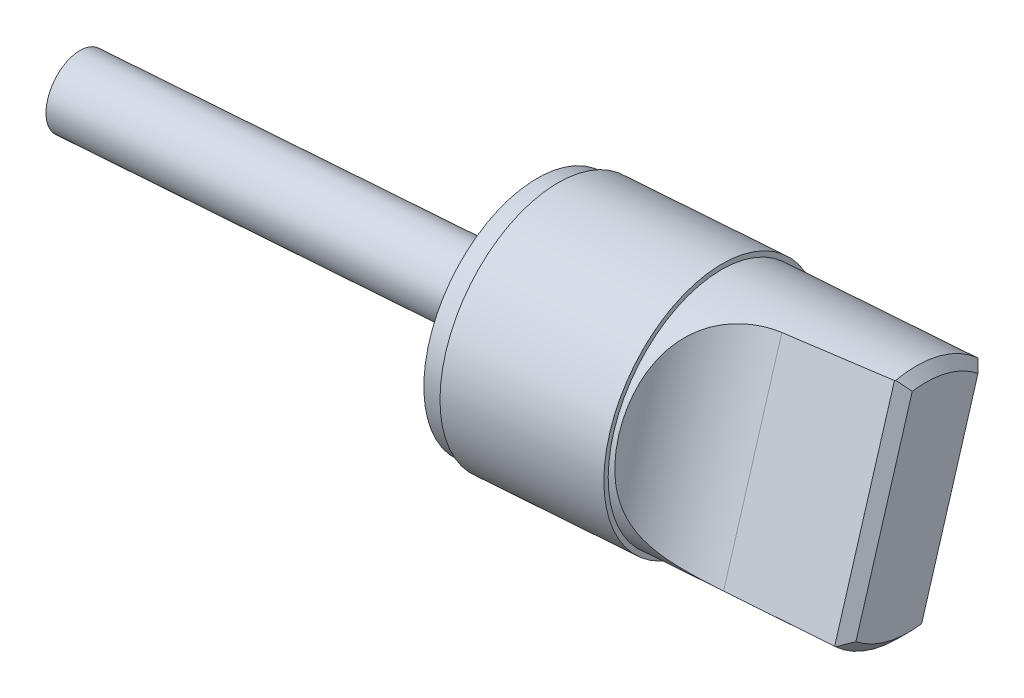
ISO-10303-21;
HEADER;
FILE_DESCRIPTION(('STEP AP214'),'2;1');
FILE_NAME('part.step','',(''),(''),'','','');
FILE_SCHEMA(('AUTOMOTIVE_DESIGN { 1 0 10303 214 1 1 1 1 }'));
ENDSEC;
DATA;
#1=APPLICATION_CONTEXT('core data for automotive mechanical design processes');
#2=APPLICATION_PROTOCOL_DEFINITION('international standard','automotive_design',2000,#1);
#3=PRODUCT_CONTEXT('',#1,'mechanical');
#4=PRODUCT('Part','Part','',(#3));
#5=PRODUCT_RELATED_PRODUCT_CATEGORY('part','',(#4));
#6=PRODUCT_DEFINITION_FORMATION('','',#4);
#7=PRODUCT_DEFINITION_CONTEXT('part definition',#1,'design');
#8=PRODUCT_DEFINITION('design','',#6,#7);
#9=PRODUCT_DEFINITION_SHAPE('','',#8);
#10=(LENGTH_UNIT() NAMED_UNIT(*) SI_UNIT(.MILLI.,.METRE.));
#11=(NAMED_UNIT(*) PLANE_ANGLE_UNIT() SI_UNIT($,.RADIAN.));
#12=(NAMED_UNIT(*) SI_UNIT($,.STERADIAN.) SOLID_ANGLE_UNIT());
#13=UNCERTAINTY_MEASURE_WITH_UNIT(LENGTH_MEASURE(1.E-05),#10,'distance_accuracy_value','');
#14=(GEOMETRIC_REPRESENTATION_CONTEXT(3) GLOBAL_UNCERTAINTY_ASSIGNED_CONTEXT((#13)) GLOBAL_UNIT_ASSIGNED_CONTEXT((#10,
#11,#12)) REPRESENTATION_CONTEXT('',''));
#15=CARTESIAN_POINT('',(0.,0.,0.));
#16=DIRECTION('',(0.,0.,1.));
#17=DIRECTION('',(1.,0.,0.));
#18=AXIS2_PLACEMENT_3D('',#15,#16,#17);
#19=CARTESIAN_POINT('',(3.76879724117186,23.5167781761015,111.248924543488));
#20=DIRECTION('',(-0.996509233346203,0.00668462435295313,0.0832145639478056));
#21=DIRECTION('',(0.0832164231983383,0.,0.996531498202679));
#22=AXIS2_PLACEMENT_3D('',#19,#20,#21);
#23=PLANE('',#22);
#24=CARTESIAN_POINT('',(3.76879724117186,23.5167781761015,111.248924543488));
#25=DIRECTION('',(-0.996509233346203,0.00668462435295313,0.0832145639478056));
#26=DIRECTION('',(0.0832164231983383,0.,0.996531498202679));
#27=AXIS2_PLACEMENT_3D('',#24,#25,#26);
#28=CIRCLE('',#27,5.99999999999998);
#29=CARTESIAN_POINT('',(3.26949870198183,23.5167781761015,105.269735554272));
#30=VERTEX_POINT('',#29);
#31=EDGE_CURVE('E279',#30,#30,#28,.T.);
#32=ORIENTED_EDGE('',*,*,#31,.T.);
#33=EDGE_LOOP('',(#32));
#34=FACE_BOUND('',#33,.T.);
#35=CARTESIAN_POINT('',(3.76879724117186,23.5167781761015,111.248924543488));
#36=DIRECTION('',(-0.996509233346203,0.00668462435295313,0.0832145639478056));
#37=DIRECTION('',(0.0832164231983383,0.,0.996531498202679));
#38=AXIS2_PLACEMENT_3D('',#35,#36,#37);
#39=CIRCLE('',#38,1.79999999999998);
#40=CARTESIAN_POINT('',(3.91858680292887,23.5167781761015,113.042681240252));
#41=VERTEX_POINT('',#40);
#42=EDGE_CURVE('E285',#41,#41,#39,.F.);
#43=ORIENTED_EDGE('',*,*,#42,.T.);
#44=EDGE_LOOP('',(#43));
#45=FACE_BOUND('',#44,.T.);
#46=ADVANCED_FACE('F40',(#34,#45),#23,.T.);
#47=CARTESIAN_POINT('',(4.76530647451807,23.5100935517485,111.16570997954));
#48=DIRECTION('',(-0.996509233346203,0.00668462435295313,0.0832145639478056));
#49=DIRECTION('',(0.0832164231983383,0.,0.996531498202679));
#50=AXIS2_PLACEMENT_3D('',#47,#48,#49);
#51=PLANE('',#50);
#52=CARTESIAN_POINT('',(4.76530647451807,23.5100935517485,111.16570997954));
#53=DIRECTION('',(0.996509233346203,-0.00668462435295313,-0.0832145639478056));
#54=DIRECTION('',(0.0832164231983383,0.,0.996531498202679));
#55=AXIS2_PLACEMENT_3D('',#52,#53,#54);
#56=CIRCLE('',#55,6.24999999999999);
#57=CARTESIAN_POINT('',(5.28540911950768,23.5100935517485,117.394031843307));
#58=VERTEX_POINT('',#57);
#59=EDGE_CURVE('E275',#58,#58,#56,.T.);
#60=ORIENTED_EDGE('',*,*,#59,.F.);
#61=EDGE_LOOP('',(#60));
#62=FACE_BOUND('',#61,.T.);
#63=CARTESIAN_POINT('',(4.76530647451806,23.5100935517485,111.16570997954));
#64=DIRECTION('',(-0.996509233346203,0.00668462435295313,0.0832145639478056));
#65=DIRECTION('',(0.0832164231983383,0.,0.996531498202679));
#66=AXIS2_PLACEMENT_3D('',#63,#64,#65);
#67=CIRCLE('',#66,5.99999999999998);
#68=CARTESIAN_POINT('',(4.26600793532803,23.5100935517485,105.186520990324));
#69=VERTEX_POINT('',#68);
#70=EDGE_CURVE('E282',#69,#69,#67,.T.);
#71=ORIENTED_EDGE('',*,*,#70,.F.);
#72=EDGE_LOOP('',(#71));
#73=FACE_BOUND('',#72,.T.);
#74=ADVANCED_FACE('F158',(#62,#73),#51,.T.);
#75=CARTESIAN_POINT('',(-40.0776090260611,23.8109016476314,114.910365357191));
#76=DIRECTION('',(-0.996509233346203,0.00668462435295313,0.0832145639478055));
#77=DIRECTION('',(0.0832164231983383,0.,0.996531498202679));
#78=AXIS2_PLACEMENT_3D('',#75,#76,#77);
#79=CYLINDRICAL_SURFACE('',#78,6.);
#80=CARTESIAN_POINT('',(17.0975541159979,29.335845858678,111.187569793292));
#81=CARTESIAN_POINT('',(17.307128040966,29.3368138773272,111.156598978778));
#82=CARTESIAN_POINT('',(17.516704575209,29.3377318237993,111.12564425978));
#83=CARTESIAN_POINT('',(17.9375998330878,29.3394758251393,111.063510204415));
#84=CARTESIAN_POINT('',(18.1489185992333,29.3403010553089,111.032331132851));
#85=CARTESIAN_POINT('',(18.5732983453913,29.3418582325442,110.969748781073));
#86=CARTESIAN_POINT('',(18.786359367326,29.3425893570261,110.938345764685));
#87=CARTESIAN_POINT('',(19.2142236526041,29.343956916831,110.875315957174));
#88=CARTESIAN_POINT('',(19.4290269573239,29.3445925315143,110.843689429126));
#89=CARTESIAN_POINT('',(19.8603758366521,29.3457676642143,110.780213047417));
#90=CARTESIAN_POINT('',(20.0769214521137,29.3463063634768,110.748363456222));
#91=CARTESIAN_POINT('',(20.5117549830615,29.3472862523289,110.684441416073));
#92=CARTESIAN_POINT('',(20.7300429389059,29.3477266249604,110.652369229141));
#93=CARTESIAN_POINT('',(21.168361181804,29.3485084460693,110.588002481347));
#94=CARTESIAN_POINT('',(21.388391508743,29.3488490793302,110.555708182201));
#95=CARTESIAN_POINT('',(21.8301945279037,29.3494299946947,110.490897718623));
#96=CARTESIAN_POINT('',(22.0519672595734,29.3496694631833,110.458381815802));
#97=CARTESIAN_POINT('',(22.2737424701569,29.3498573213283,110.425882534628));
#98=B_SPLINE_CURVE_WITH_KNOTS('',3,(#80,#81,#82,#83,#84,#85,#86,#87,#88,#89,#90,#91,#92,#93,#94,
#95,#96,#97),.UNSPECIFIED.,.F.,.F.,(4,2,2,2,2,2,2,2,4),(0.,0.635556619465426,1.27638100599797,
1.92247319279063,2.57383321223107,3.23046109592741,3.89235687473314,4.55952057877082,
5.23195223745506),.UNSPECIFIED.);
#99=CARTESIAN_POINT('',(17.0975541159979,29.335845858678,111.187569793292));
#100=VERTEX_POINT('',#99);
#101=CARTESIAN_POINT('',(22.2737424701569,29.3498573213283,110.425882534628));
#102=VERTEX_POINT('',#101);
#103=EDGE_CURVE('E127',#100,#102,#98,.T.);
#104=ORIENTED_EDGE('',*,*,#103,.T.);
#105=CARTESIAN_POINT('',(24.6954911414422,23.3764010646895,109.501418700584));
#106=DIRECTION('',(0.762044476241738,0.214386525672637,0.611004610325872));
#107=DIRECTION('',(-0.647232396586478,0.223840012091948,0.728687775247808));
#108=AXIS2_PLACEMENT_3D('',#105,#106,#107);
#109=ELLIPSE('',#108,8.48528137423865,6.);
#110=CARTESIAN_POINT('',(22.3010724096489,29.3535484319548,110.390501535133));
#111=VERTEX_POINT('',#110);
#112=EDGE_CURVE('E450',#102,#111,#109,.F.);
#113=ORIENTED_EDGE('',*,*,#112,.T.);
#114=CARTESIAN_POINT('',(22.2042180581046,23.3931126255717,109.709455110451));
#115=DIRECTION('',(0.996509233346202,-0.00668462435295146,-0.0832145639478088));
#116=DIRECTION('',(-0.0832164231983416,0.,-0.996531498202678));
#117=AXIS2_PLACEMENT_3D('',#114,#115,#116);
#118=CIRCLE('',#117,6.);
#119=CARTESIAN_POINT('',(21.8951504092216,27.804183649226,105.653973682471));
#120=VERTEX_POINT('',#119);
#121=EDGE_CURVE('E459',#111,#120,#118,.F.);
#122=ORIENTED_EDGE('',*,*,#121,.T.);
#123=CARTESIAN_POINT('',(24.6954911414422,23.3764010646895,109.501418700584));
#124=DIRECTION('',(0.647232396586453,-0.223840012091955,-0.728687775247829));
#125=DIRECTION('',(-0.76204447624176,-0.214386525672629,-0.611004610325848));
#126=AXIS2_PLACEMENT_3D('',#123,#124,#125);
#127=ELLIPSE('',#126,8.48528137423876,6.);
#128=CARTESIAN_POINT('',(21.8629243882956,27.7818046721149,105.632224430202));
#129=VERTEX_POINT('',#128);
#130=EDGE_CURVE('E187',#120,#129,#127,.F.);
#131=ORIENTED_EDGE('',*,*,#130,.T.);
#132=CARTESIAN_POINT('',(21.8629243882956,27.7818046721149,105.632224430202));
#133=CARTESIAN_POINT('',(21.6390832213717,27.7737312596167,105.64061696244));
#134=CARTESIAN_POINT('',(21.4152445407694,27.7656062650497,105.649026202762));
#135=CARTESIAN_POINT('',(20.9693258313364,27.7493161603346,105.665812460723));
#136=CARTESIAN_POINT('',(20.7472457628809,27.7411518631266,105.674189214687));
#137=CARTESIAN_POINT('',(20.3048442515478,27.7247846036678,105.690910073234));
#138=CARTESIAN_POINT('',(20.0845227685496,27.7165824557343,105.699253913353));
#139=CARTESIAN_POINT('',(19.6456384016228,27.7001409200622,105.715908504527));
#140=CARTESIAN_POINT('',(19.4270754770663,27.6919023482522,105.724218990413));
#141=CARTESIAN_POINT('',(18.9917081991741,27.6753893791907,105.740806421285));
#142=CARTESIAN_POINT('',(18.7749038046999,27.6671157996048,105.749083100477));
#143=CARTESIAN_POINT('',(18.3430535581662,27.6505342134904,105.765602454047));
#144=CARTESIAN_POINT('',(18.1280076644508,27.6422270265346,105.773844862087));
#145=CARTESIAN_POINT('',(17.6996743892962,27.6255796137684,105.790295197898));
#146=CARTESIAN_POINT('',(17.48638696568,27.6172402095692,105.79850285887));
#147=CARTESIAN_POINT('',(17.0615706004984,27.6005297231502,105.814883212962));
#148=CARTESIAN_POINT('',(16.8500416162204,27.5921594648542,105.82305563891));
#149=CARTESIAN_POINT('',(16.6385152504412,27.5837391695882,105.831244268006));
#150=B_SPLINE_CURVE_WITH_KNOTS('',3,(#132,#133,#134,#135,#136,#137,#138,#139,#140,#141,#142,
#143,#144,#145,#146,#147,#148,#149),.UNSPECIFIED.,.F.,.F.,(4,2,2,2,2,2,2,2,4),(0.,
0.67243165868229,1.33959536271856,2.00149114152344,2.65811902521952,3.30947904466022,
3.95557123145374,4.59639561798769,5.23195223745509),.UNSPECIFIED.);
#151=CARTESIAN_POINT('',(16.6385152504412,27.5837391695882,105.831244268006));
#152=VERTEX_POINT('',#151);
#153=EDGE_CURVE('E183',#129,#152,#150,.T.);
#154=ORIENTED_EDGE('',*,*,#153,.T.);
#155=CARTESIAN_POINT('',(16.6385152504412,27.5837391695882,105.831244268006));
#156=CARTESIAN_POINT('',(16.5310003516422,27.5794510955487,105.835427128186));
#157=CARTESIAN_POINT('',(16.4234898257772,27.5719646684466,105.836489964287));
#158=CARTESIAN_POINT('',(16.2092234176299,27.5504851001404,105.832548053947));
#159=CARTESIAN_POINT('',(16.1024676033274,27.5364913801942,105.827542767758));
#160=CARTESIAN_POINT('',(15.8904261722782,27.5018798231157,105.811632663495));
#161=CARTESIAN_POINT('',(15.7851412689567,27.481258880581,105.800725078063));
#162=CARTESIAN_POINT('',(15.57686945349,27.433244708516,105.773333472931));
#163=CARTESIAN_POINT('',(15.4738824309435,27.4058518051111,105.756849721754));
#164=CARTESIAN_POINT('',(15.2708196906816,27.3440889971268,105.718718009489));
#165=CARTESIAN_POINT('',(15.1707487404485,27.3097083279363,105.697062071555));
#166=CARTESIAN_POINT('',(14.9744604009771,27.2338587672631,105.649176948209));
#167=CARTESIAN_POINT('',(14.8782429556063,27.1923899790764,105.622947829442));
#168=CARTESIAN_POINT('',(14.690508097882,27.1023266329171,105.566653005323));
#169=CARTESIAN_POINT('',(14.5989857450549,27.0537397816712,105.536591453857));
#170=CARTESIAN_POINT('',(14.4212218242649,26.9494073994158,105.473435298028));
#171=CARTESIAN_POINT('',(14.3349800956392,26.8936620863622,105.440340786019));
#172=CARTESIAN_POINT('',(14.1701699118619,26.7764020095811,105.372779143392));
#173=CARTESIAN_POINT('',(14.0914762468999,26.7150372627526,105.338356892351));
#174=CARTESIAN_POINT('',(13.9401373183341,26.5857666433894,105.268411547696));
#175=CARTESIAN_POINT('',(13.8674940981071,26.5178585775891,105.232888087691));
#176=CARTESIAN_POINT('',(13.7285982297257,26.3758766584415,105.161709985309));
#177=CARTESIAN_POINT('',(13.6623450017341,26.3018033656744,105.12605535514));
#178=CARTESIAN_POINT('',(13.5363457266414,26.1479213416551,105.055536795669));
#179=CARTESIAN_POINT('',(13.4766020612149,26.0681105288062,105.02067315944));
#180=CARTESIAN_POINT('',(13.363199820569,25.9026933457421,104.952369795153));
#181=CARTESIAN_POINT('',(13.30959180821,25.8170469739229,104.918943144579));
#182=CARTESIAN_POINT('',(13.2088285335628,25.641132820583,104.854613400168));
#183=CARTESIAN_POINT('',(13.1616739025502,25.5508645881327,104.823710553331));
#184=CARTESIAN_POINT('',(13.073521339007,25.3663457897424,104.765129048611));
#185=CARTESIAN_POINT('',(13.0325247242658,25.2720943769323,104.737451081123));
#186=CARTESIAN_POINT('',(12.9563207124429,25.0802954818926,104.685917510759));
#187=CARTESIAN_POINT('',(12.9211123407458,24.9827485578974,104.662061264406));
#188=CARTESIAN_POINT('',(12.8521524365468,24.7731824179137,104.61605072477));
#189=CARTESIAN_POINT('',(12.8190735866866,24.6608230131434,104.594437342143));
#190=CARTESIAN_POINT('',(12.7589300674269,24.4335512943178,104.557089212026));
#191=CARTESIAN_POINT('',(12.7318658404615,24.3186387931409,104.541354896941));
#192=CARTESIAN_POINT('',(12.6830636830541,24.0868942322863,104.516119981903));
#193=CARTESIAN_POINT('',(12.6613312428976,23.9700603250411,104.506625790831));
#194=CARTESIAN_POINT('',(12.6225989473755,23.735263985058,104.494150152177));
#195=CARTESIAN_POINT('',(12.6055995550382,23.617301443074,104.491169341597));
#196=CARTESIAN_POINT('',(12.5729941115164,23.3589069658805,104.491953876552));
#197=CARTESIAN_POINT('',(12.5582331982309,23.2183708383704,104.497074957476));
#198=CARTESIAN_POINT('',(12.533760645705,22.93750666702,104.516853372767));
#199=CARTESIAN_POINT('',(12.5240502122985,22.7971786808421,104.531512982639));
#200=CARTESIAN_POINT('',(12.5090709365751,22.5178593780214,104.570361029452));
#201=CARTESIAN_POINT('',(12.5037946138332,22.3788662028321,104.594533316743));
#202=CARTESIAN_POINT('',(12.4972259242448,22.1028197446528,104.652333192123));
#203=CARTESIAN_POINT('',(12.49593154475,21.9657655165161,104.685955994126));
#204=CARTESIAN_POINT('',(12.4966797655536,21.7907718532055,104.735300519355));
#205=CARTESIAN_POINT('',(12.4970049783364,21.7515900374157,104.746770229251));
#206=CARTESIAN_POINT('',(12.4979687598149,21.6734664061278,104.770483398709));
#207=CARTESIAN_POINT('',(12.4986073212451,21.6345245850862,104.782726840324));
#208=CARTESIAN_POINT('',(12.5024607754568,21.4461205185515,104.84402642008));
#209=CARTESIAN_POINT('',(12.5078275987956,21.2983881881929,104.898430606936));
#210=CARTESIAN_POINT('',(12.523308474097,21.0076677472057,105.018314690971));
#211=CARTESIAN_POINT('',(12.5334254606528,20.8646826278952,105.083801418793));
#212=CARTESIAN_POINT('',(12.5588935729356,20.5840788423164,105.225518683649));
#213=CARTESIAN_POINT('',(12.5742599824219,20.4464771687406,105.301780207085));
#214=CARTESIAN_POINT('',(12.6109698048166,20.1780972135999,105.464188290557));
#215=CARTESIAN_POINT('',(12.6323122014785,20.0473177763617,105.55033316841));
#216=CARTESIAN_POINT('',(12.6821286463629,19.7929328116685,105.732047896268));
#217=CARTESIAN_POINT('',(12.7106362029738,19.6693644502173,105.827660713554));
#218=CARTESIAN_POINT('',(12.776033922571,19.4310711532496,106.026786216415));
#219=CARTESIAN_POINT('',(12.8129252379193,19.3163474363505,106.130299986689));
#220=CARTESIAN_POINT('',(12.8964533192267,19.0970423673963,106.343381880281));
#221=CARTESIAN_POINT('',(12.9430652215889,18.9924361169616,106.452934042398));
#222=CARTESIAN_POINT('',(13.047603474781,18.7940109176959,106.676302936608));
#223=CARTESIAN_POINT('',(13.1055245125932,18.7001869361226,106.790117645945));
#224=CARTESIAN_POINT('',(13.2154443468684,18.549593568679,106.986269341444));
#225=CARTESIAN_POINT('',(13.2643044749933,18.4899595261868,107.06818180919));
#226=CARTESIAN_POINT('',(13.3688275516785,18.3767170848994,107.231820366093));
#227=CARTESIAN_POINT('',(13.4244888526455,18.3231072327531,107.313546495524));
#228=CARTESIAN_POINT('',(13.5428570808256,18.2220368932085,107.475613088656));
#229=CARTESIAN_POINT('',(13.6055601565349,18.1745730745259,107.555954282377));
#230=CARTESIAN_POINT('',(13.7381378758993,18.085737986968,107.714063119579));
#231=CARTESIAN_POINT('',(13.8080127265711,18.044366894046,107.791830688685));
#232=CARTESIAN_POINT('',(13.9551321511697,17.9674058285454,107.943840995702));
#233=CARTESIAN_POINT('',(14.0324053412759,17.9318398716293,108.018068234399));
#234=CARTESIAN_POINT('',(14.193780708049,17.8663880464846,108.161436788912));
#235=CARTESIAN_POINT('',(14.2778829690153,17.8365022483882,108.230578041927));
#236=CARTESIAN_POINT('',(14.4524499079819,17.781971460477,108.362675009124));
#237=CARTESIAN_POINT('',(14.5429165059378,17.7573280612581,108.425628842874));
#238=CARTESIAN_POINT('',(14.7295390700441,17.7127665069429,108.544356971484));
#239=CARTESIAN_POINT('',(14.825694703735,17.6928480760658,108.600131685279));
#240=CARTESIAN_POINT('',(15.0162100079787,17.6583709559475,108.700182408721));
#241=CARTESIAN_POINT('',(15.1102457269556,17.643539566282,108.744982930674));
#242=CARTESIAN_POINT('',(15.3019283268204,17.6169968933771,108.827168485353));
#243=CARTESIAN_POINT('',(15.3995752113178,17.6052856132567,108.864553510666));
#244=CARTESIAN_POINT('',(15.5977418408712,17.5845343986575,108.931518450217));
#245=CARTESIAN_POINT('',(15.6982604795201,17.5754934501986,108.961101326635));
#246=CARTESIAN_POINT('',(15.9014669492774,17.5596789640717,109.012211501048));
#247=CARTESIAN_POINT('',(16.0041542304886,17.5529048587738,109.033740815858));
#248=CARTESIAN_POINT('',(16.2292157627013,17.5402547910371,109.071639198179));
#249=CARTESIAN_POINT('',(16.3518779957388,17.534745954514,109.086436204674));
#250=CARTESIAN_POINT('',(16.5978721202439,17.5260352151629,109.10451902941));
#251=CARTESIAN_POINT('',(16.7212020807232,17.5228285234063,109.107828798792));
#252=CARTESIAN_POINT('',(16.8444192088597,17.5205888493606,109.105353540698));
#253=B_SPLINE_CURVE_WITH_KNOTS('',3,(#155,#156,#157,#158,#159,#160,#161,#162,#163,#164,#165,
#166,#167,#168,#169,#170,#171,#172,#173,#174,#175,#176,#177,#178,#179,#180,#181,#182,#183,#184,
#185,#186,#187,#188,#189,#190,#191,#192,#193,#194,#195,#196,#197,#198,#199,#200,#201,#202,#203,
#204,#205,#206,#207,#208,#209,#210,#211,#212,#213,#214,#215,#216,#217,#218,#219,#220,#221,#222,
#223,#224,#225,#226,#227,#228,#229,#230,#231,#232,#233,#234,#235,#236,#237,#238,#239,#240,#241,
#242,#243,#244,#245,#246,#247,#248,#249,#250,#251,#252),.UNSPECIFIED.,.F.,.F.,(4,2,2,2,2,2,2,2,
2,2,2,2,2,2,2,2,2,2,2,2,2,2,2,2,2,2,2,2,2,2,2,2,2,2,2,2,2,2,2,2,2,2,2,2,2,2,2,2,4),(0.,
0.322956201524256,0.645941131444993,0.969077627745525,1.29219856540502,1.61582109396317,
1.93943890673198,2.26270889306509,2.58596903903317,2.90227096124837,3.21867927649908,
3.53505885333392,3.85155379901642,4.17049322999403,4.48946383765719,4.80850260674083,
5.12748760142862,5.48445557539319,5.84144979914857,6.19881010100605,6.55620535071932,
6.97997720203613,7.40385018516633,7.8270066431614,8.24994918421737,8.37242510253248,
8.49489818113948,8.96686752463378,9.43912882949069,9.91277701625559,10.3863447056507,
10.8621696732382,11.3380600833876,11.8127478578457,12.2872131588459,12.6243417097863,
12.9613887521988,13.2982523361559,13.6351256465742,13.9733590819969,14.3115966932705,
14.6499367832862,14.9882571206586,15.3035281351932,15.6187994648747,15.9339509251421,
16.2490234106158,16.61947356718,16.9891508615608),.UNSPECIFIED.);
#254=CARTESIAN_POINT('',(16.8444192088597,17.5205888493606,109.105353540698));
#255=VERTEX_POINT('',#254);
#256=EDGE_CURVE('E184',#152,#255,#253,.T.);
#257=ORIENTED_EDGE('',*,*,#256,.T.);
#258=CARTESIAN_POINT('',(16.8444192088597,17.5205888493606,109.105353540698));
#259=CARTESIAN_POINT('',(17.0561955028364,17.5167943963539,109.101139056807));
#260=CARTESIAN_POINT('',(17.2679723673967,17.5130499941937,109.096908211862));
#261=CARTESIAN_POINT('',(17.6932824786739,17.5056296129176,109.088378987402));
#262=CARTESIAN_POINT('',(17.9068157343775,17.5019544581547,109.084080338783));
#263=CARTESIAN_POINT('',(18.3356386028268,17.494673963177,109.075415098308));
#264=CARTESIAN_POINT('',(18.5509282241143,17.4910694452076,109.071048238412));
#265=CARTESIAN_POINT('',(18.9832637976576,17.4839316298624,109.062246141347));
#266=CARTESIAN_POINT('',(19.2003097580154,17.4803991527944,109.057810636969));
#267=CARTESIAN_POINT('',(19.6361579820478,17.4734068267538,109.04887080175));
#268=CARTESIAN_POINT('',(19.8549602533846,17.4699477962102,109.044366204391));
#269=CARTESIAN_POINT('',(20.2943210703228,17.4631037762176,109.035287715261));
#270=CARTESIAN_POINT('',(20.514879623148,17.4597196034076,109.030713557496));
#271=CARTESIAN_POINT('',(20.9577529724158,17.4530267133597,109.021495463682));
#272=CARTESIAN_POINT('',(21.1800677756435,17.4497188110253,109.016851262021));
#273=CARTESIAN_POINT('',(21.6264535939679,17.4431798889166,109.007492571574));
#274=CARTESIAN_POINT('',(21.8505246154144,17.4399496824499,109.002777817354));
#275=CARTESIAN_POINT('',(22.0745960121356,17.4367710671808,108.998046203146));
#276=B_SPLINE_CURVE_WITH_KNOTS('',3,(#258,#259,#260,#261,#262,#263,#264,#265,#266,#267,#268,
#269,#270,#271,#272,#273,#274,#275),.UNSPECIFIED.,.F.,.F.,(4,2,2,2,2,2,2,2,4),(0.,
0.635556619467432,1.27638100600141,1.92247319279492,2.57383321223564,3.23046109593171,
3.89235687473655,4.5595205787728,5.23195223745503),.UNSPECIFIED.);
#277=CARTESIAN_POINT('',(22.0745960121356,17.4367710671808,108.998046203146));
#278=VERTEX_POINT('',#277);
#279=EDGE_CURVE('E194',#255,#278,#276,.T.);
#280=ORIENTED_EDGE('',*,*,#279,.T.);
#281=CARTESIAN_POINT('',(24.6954911414422,23.3764010646895,109.501418700584));
#282=DIRECTION('',(0.647232396586453,-0.223840012091955,-0.728687775247829));
#283=DIRECTION('',(-0.76204447624176,-0.214386525672629,-0.611004610325848));
#284=AXIS2_PLACEMENT_3D('',#281,#282,#283);
#285=ELLIPSE('',#284,8.48528137423876,6.);
#286=CARTESIAN_POINT('',(22.1073637065602,17.4326768191885,109.028408685768));
#287=VERTEX_POINT('',#286);
#288=EDGE_CURVE('E467',#278,#287,#285,.F.);
#289=ORIENTED_EDGE('',*,*,#288,.T.);
#290=CARTESIAN_POINT('',(22.2042180581046,23.3931126255717,109.709455110451));
#291=DIRECTION('',(0.996509233346202,-0.00668462435295164,-0.0832145639478111));
#292=DIRECTION('',(-0.0832164231983439,0.,-0.996531498202678));
#293=AXIS2_PLACEMENT_3D('',#290,#291,#292);
#294=CIRCLE('',#293,6.);
#295=CARTESIAN_POINT('',(22.5132857069876,18.9820416019173,113.764936538431));
#296=VERTEX_POINT('',#295);
#297=EDGE_CURVE('E147',#287,#296,#294,.F.);
#298=ORIENTED_EDGE('',*,*,#297,.T.);
#299=CARTESIAN_POINT('',(24.6954911414422,23.3764010646895,109.501418700584));
#300=DIRECTION('',(0.762044476241738,0.214386525672637,0.611004610325872));
#301=DIRECTION('',(-0.647232396586478,0.223840012091948,0.728687775247808));
#302=AXIS2_PLACEMENT_3D('',#299,#300,#301);
#303=ELLIPSE('',#302,8.48528137423865,6.);
#304=CARTESIAN_POINT('',(22.4854140939968,19.0048237163941,113.791704307572));
#305=VERTEX_POINT('',#304);
#306=EDGE_CURVE('E136',#296,#305,#303,.F.);
#307=ORIENTED_EDGE('',*,*,#306,.T.);
#308=CARTESIAN_POINT('',(22.4854140939968,19.0048237163941,113.791704307572));
#309=CARTESIAN_POINT('',(22.2634086536165,19.0158878860165,113.820542670716));
#310=CARTESIAN_POINT('',(22.0414035811029,19.0270036185616,113.849364087435));
#311=CARTESIAN_POINT('',(21.5991334530515,19.0492517300211,113.906746983498));
#312=CARTESIAN_POINT('',(21.3788683913406,19.0603832963025,113.935308730342));
#313=CARTESIAN_POINT('',(20.940078310508,19.0826616247002,113.992172713403));
#314=CARTESIAN_POINT('',(20.7215532848369,19.0938075728123,114.020475217981));
#315=CARTESIAN_POINT('',(20.2862433038779,19.1161132396249,114.076821156085));
#316=CARTESIAN_POINT('',(20.069458341636,19.1272721427161,114.104864858754));
#317=CARTESIAN_POINT('',(19.6376285161676,19.149602305118,114.16069364481));
#318=CARTESIAN_POINT('',(19.4225836455642,19.1607727470887,114.188478998043));
#319=CARTESIAN_POINT('',(18.9942340332763,19.1831245887434,114.24379154905));
#320=CARTESIAN_POINT('',(18.7809292837693,19.1943051691867,114.271319017294));
#321=CARTESIAN_POINT('',(18.3560599443161,19.2166758996952,114.326116273736));
#322=CARTESIAN_POINT('',(18.144495346083,19.2278652284878,114.353386332947));
#323=CARTESIAN_POINT('',(17.7231063421081,19.2502520948428,114.40766925868));
#324=CARTESIAN_POINT('',(17.5132819275824,19.2614488088269,114.434682396675));
#325=CARTESIAN_POINT('',(17.3034580744165,19.2726955384504,114.461679065985));
#326=B_SPLINE_CURVE_WITH_KNOTS('',3,(#308,#309,#310,#311,#312,#313,#314,#315,#316,#317,#318,
#319,#320,#321,#322,#323,#324,#325),.UNSPECIFIED.,.F.,.F.,(4,2,2,2,2,2,2,2,4),(0.,
0.672431658683144,1.33959536272003,2.00149114152526,2.65811902522144,3.30947904466202,
3.95557123145515,4.59639561798846,5.23195223745499),.UNSPECIFIED.);
#327=CARTESIAN_POINT('',(17.3034580744164,19.2726955384504,114.461679065985));
#328=VERTEX_POINT('',#327);
#329=EDGE_CURVE('E124',#305,#328,#326,.T.);
#330=ORIENTED_EDGE('',*,*,#329,.T.);
#331=CARTESIAN_POINT('',(17.3034580744164,19.2726955384504,114.461679065985));
#332=CARTESIAN_POINT('',(17.1968052016093,19.2784202585879,114.475380513475));
#333=CARTESIAN_POINT('',(17.0907167013577,19.2873395166202,114.492154491347));
#334=CARTESIAN_POINT('',(16.8803768093245,19.3116673612089,114.531553602621));
#335=CARTESIAN_POINT('',(16.7761255818013,19.3270765249495,114.554179256377));
#336=CARTESIAN_POINT('',(16.5701395085277,19.364492227481,114.604997192225));
#337=CARTESIAN_POINT('',(16.4684058665914,19.3865018588134,114.633192081573));
#338=CARTESIAN_POINT('',(16.2682196086068,19.437255984201,114.694692412783));
#339=CARTESIAN_POINT('',(16.1697668348169,19.4660001539296,114.727997608511));
#340=CARTESIAN_POINT('',(15.9766814386562,19.5304203396798,114.799210092462));
#341=CARTESIAN_POINT('',(15.8820549836729,19.5661070469608,114.837124444402));
#342=CARTESIAN_POINT('',(15.6974548191853,19.6445116231664,114.916816067587));
#343=CARTESIAN_POINT('',(15.6074810419018,19.687229389626,114.958593282533));
#344=CARTESIAN_POINT('',(15.4328992324947,19.779723170683,115.045143745494));
#345=CARTESIAN_POINT('',(15.3482855371733,19.8294915496835,115.089913725092));
#346=CARTESIAN_POINT('',(15.1848637224738,19.9361126196901,115.18156095883));
#347=CARTESIAN_POINT('',(15.1060554264518,19.992965095003,115.228438148783));
#348=CARTESIAN_POINT('',(14.956309662699,20.1123352258376,115.322267120537));
#349=CARTESIAN_POINT('',(14.8852392886119,20.1747045959141,115.369195577027));
#350=CARTESIAN_POINT('',(14.7493323523568,20.3059020721884,115.463127693292));
#351=CARTESIAN_POINT('',(14.6844978950688,20.3747323438252,115.510131373052));
#352=CARTESIAN_POINT('',(14.561234376878,20.5184728387704,115.603201373982));
#353=CARTESIAN_POINT('',(14.502804734727,20.5933825092872,115.649267779901));
#354=CARTESIAN_POINT('',(14.3923072042519,20.7488509634699,115.739535256785));
#355=CARTESIAN_POINT('',(14.3402416435315,20.8294117971425,115.783735641423));
#356=CARTESIAN_POINT('',(14.2419518532985,20.9962490189354,115.869716574017));
#357=CARTESIAN_POINT('',(14.1957758459139,21.082564746006,115.911475795343));
#358=CARTESIAN_POINT('',(14.109429680147,21.2597340370609,115.991430312685));
#359=CARTESIAN_POINT('',(14.0692601092843,21.350588043799,116.029625259924));
#360=CARTESIAN_POINT('',(13.9945101788353,21.5361995987258,116.101810110754));
#361=CARTESIAN_POINT('',(13.9599310154523,21.6309579769207,116.135799114017));
#362=CARTESIAN_POINT('',(13.8958911922022,21.823697633294,116.199043895067));
#363=CARTESIAN_POINT('',(13.866429670587,21.9216783655564,116.228300469679));
#364=CARTESIAN_POINT('',(13.8088537025887,22.1320933133027,116.284877521973));
#365=CARTESIAN_POINT('',(13.7813173856824,22.2448593270701,116.311552638604));
#366=CARTESIAN_POINT('',(13.7312341530002,22.4728704514182,116.358105370937));
#367=CARTESIAN_POINT('',(13.7086876042709,22.5881157436905,116.377982486639));
#368=CARTESIAN_POINT('',(13.6678382849793,22.8204616902868,116.410703843639));
#369=CARTESIAN_POINT('',(13.6495398898885,22.9375641259985,116.423540852207));
#370=CARTESIAN_POINT('',(13.6165446267676,23.172841617354,116.442006176973));
#371=CARTESIAN_POINT('',(13.6018481111218,23.2910167767742,116.447633788078));
#372=CARTESIAN_POINT('',(13.5730095123115,23.5498234230956,116.451980203262));
#373=CARTESIAN_POINT('',(13.5594773288133,23.6905493418465,116.449221767493));
#374=CARTESIAN_POINT('',(13.5358075132439,23.9717364541546,116.43346353188));
#375=CARTESIAN_POINT('',(13.5256706920425,24.1121975765213,116.420461288123));
#376=CARTESIAN_POINT('',(13.5081785843945,24.3917346986986,116.384324798733));
#377=CARTESIAN_POINT('',(13.5008186249408,24.5308126385814,116.361207717633));
#378=CARTESIAN_POINT('',(13.4884331421464,24.8069862421178,116.304990630588));
#379=CARTESIAN_POINT('',(13.4834064405667,24.9440828723227,116.271895677186));
#380=CARTESIAN_POINT('',(13.4782919003426,25.1191058250811,116.222915766107));
#381=CARTESIAN_POINT('',(13.4772323526376,25.1582925668193,116.21150737763));
#382=CARTESIAN_POINT('',(13.4752907229847,25.2364227575523,116.187875864425));
#383=CARTESIAN_POINT('',(13.4744086369226,25.2753662121671,116.175652758593));
#384=CARTESIAN_POINT('',(13.4705519845419,25.4637703001552,116.114353445903));
#385=CARTESIAN_POINT('',(13.4687893426902,25.6114784535182,116.059648288037));
#386=CARTESIAN_POINT('',(13.468045025982,25.9021000410727,115.938533611995));
#387=CARTESIAN_POINT('',(13.4690650721129,26.0450104527162,115.872116874408));
#388=CARTESIAN_POINT('',(13.4744130104561,26.3254075229776,115.727826282452));
#389=CARTESIAN_POINT('',(13.4787506079679,26.4628770212753,115.649919354944));
#390=CARTESIAN_POINT('',(13.4915891744393,26.7309246038139,115.483373680534));
#391=CARTESIAN_POINT('',(13.5000894357009,26.8615038552925,115.394736759773));
#392=CARTESIAN_POINT('',(13.5224635145643,27.1154045630246,115.20699368541));
#393=CARTESIAN_POINT('',(13.5363627522993,27.2386884579794,115.107839643636));
#394=CARTESIAN_POINT('',(13.5709989956569,27.4763107230665,114.900360698249));
#395=CARTESIAN_POINT('',(13.5917369414486,27.5906478605445,114.792034535198));
#396=CARTESIAN_POINT('',(13.6416832189791,27.8090575780863,114.567806723238));
#397=CARTESIAN_POINT('',(13.6708700125332,27.9131553677946,114.451924910357));
#398=CARTESIAN_POINT('',(13.7395493536743,28.1104186164123,114.214091296607));
#399=CARTESIAN_POINT('',(13.7790370648191,28.2035891761469,114.092142366032));
#400=CARTESIAN_POINT('',(13.8568996538252,28.3529228914793,113.880309699452));
#401=CARTESIAN_POINT('',(13.892288182507,28.4119917905647,113.791361957968));
#402=CARTESIAN_POINT('',(13.9697238712894,28.5240136450736,113.612528740726));
#403=CARTESIAN_POINT('',(14.0117694194452,28.5769680757133,113.522643496887));
#404=CARTESIAN_POINT('',(14.1029558198753,28.6766327143102,113.343077821498));
#405=CARTESIAN_POINT('',(14.1520927976396,28.7233463053782,113.253397305099));
#406=CARTESIAN_POINT('',(14.2577840089088,28.8105830752859,113.075391567295));
#407=CARTESIAN_POINT('',(14.3143384565356,28.8511060753473,112.987066385097));
#408=CARTESIAN_POINT('',(14.4352219180544,28.9262693666183,112.812676211885));
#409=CARTESIAN_POINT('',(14.4995813998194,28.9608852458273,112.726621786208));
#410=CARTESIAN_POINT('',(14.6358019802746,29.0243407852883,112.55840216544));
#411=CARTESIAN_POINT('',(14.7076631715706,29.0531803742215,112.476237018378));
#412=CARTESIAN_POINT('',(14.8586153265652,29.1055275668482,112.316957232845));
#413=CARTESIAN_POINT('',(14.9377084741333,29.1290335524172,112.239844132111));
#414=CARTESIAN_POINT('',(15.1026325959836,29.1712369173054,112.091759723397));
#415=CARTESIAN_POINT('',(15.188463176635,29.1899345772758,112.020788057116));
#416=CARTESIAN_POINT('',(15.3601890415536,29.2219817689398,111.890487999372));
#417=CARTESIAN_POINT('',(15.4456815333782,29.2356088760861,111.830695783134));
#418=CARTESIAN_POINT('',(15.621415621448,29.2596869029469,111.717828706949));
#419=CARTESIAN_POINT('',(15.7116572224404,29.2701378194864,111.664753853717));
#420=CARTESIAN_POINT('',(15.89623211517,29.2883215884312,111.56582767606));
#421=CARTESIAN_POINT('',(15.9905638381588,29.2960554727616,111.519973612847));
#422=CARTESIAN_POINT('',(16.1826720360017,29.3092181720654,111.435852266449));
#423=CARTESIAN_POINT('',(16.2804476417007,29.3146475641877,111.397583084949));
#424=CARTESIAN_POINT('',(16.4962552641609,29.3243402637544,111.322869454724));
#425=CARTESIAN_POINT('',(16.6148270812311,29.3282308924856,111.28792794217));
#426=CARTESIAN_POINT('',(16.8545094147499,29.3336836944585,111.229288187983));
#427=CARTESIAN_POINT('',(16.975614118674,29.3352507085728,111.205566641839));
#428=CARTESIAN_POINT('',(17.0975541159979,29.335845858678,111.187569793292));
#429=B_SPLINE_CURVE_WITH_KNOTS('',3,(#331,#332,#333,#334,#335,#336,#337,#338,#339,#340,#341,
#342,#343,#344,#345,#346,#347,#348,#349,#350,#351,#352,#353,#354,#355,#356,#357,#358,#359,#360,
#361,#362,#363,#364,#365,#366,#367,#368,#369,#370,#371,#372,#373,#374,#375,#376,#377,#378,#379,
#380,#381,#382,#383,#384,#385,#386,#387,#388,#389,#390,#391,#392,#393,#394,#395,#396,#397,#398,
#399,#400,#401,#402,#403,#404,#405,#406,#407,#408,#409,#410,#411,#412,#413,#414,#415,#416,#417,
#418,#419,#420,#421,#422,#423,#424,#425,#426,#427,#428),.UNSPECIFIED.,.F.,.F.,(4,2,2,2,2,2,2,2,
2,2,2,2,2,2,2,2,2,2,2,2,2,2,2,2,2,2,2,2,2,2,2,2,2,2,2,2,2,2,2,2,2,2,2,2,2,2,2,2,4),(0.,
0.322956201524263,0.645941131444994,0.969077627745526,1.29219856540503,1.61582109396317,
1.93943890673198,2.26270889306509,2.58596903903317,2.90227096124836,3.21867927649908,
3.53505885333392,3.85155379901643,4.17049322999403,4.48946383765719,4.80850260674083,
5.12748760142863,5.48445557539319,5.84144979914858,6.19881010100606,6.55620535071933,
6.97997720203613,7.40385018516633,7.82700664316142,8.24994918421738,8.37242510253246,
8.49489818113942,8.96686752463371,9.43912882949062,9.91277701625553,10.3863447056506,
10.8621696732381,11.3380600833875,11.8127478578456,12.2872131588458,12.6243417097862,
12.9613887521987,13.2982523361558,13.6351256465742,13.9733590819968,14.3115966932704,
14.6499367832861,14.9882571206586,15.3035281351932,15.6187994648746,15.9339509251421,
16.2490234106157,16.6194735671799,16.9891508615608),.UNSPECIFIED.);
#430=EDGE_CURVE('E109',#328,#100,#429,.T.);
#431=ORIENTED_EDGE('',*,*,#430,.T.);
#432=EDGE_LOOP('',(#104,#113,#122,#131,#154,#257,#280,#289,#298,#307,#330,#431));
#433=FACE_BOUND('',#432,.T.);
#434=CARTESIAN_POINT('',(12.7373803412877,23.4566165569249,110.499993467957));
#435=DIRECTION('',(-0.996509233346203,0.00668462435295313,0.0832145639478056));
#436=DIRECTION('',(0.0832164231983383,0.,0.996531498202679));
#437=AXIS2_PLACEMENT_3D('',#434,#435,#436);
#438=CIRCLE('',#437,5.99999999999998);
#439=CARTESIAN_POINT('',(13.2366788804777,23.4566165569249,116.479182457173));
#440=VERTEX_POINT('',#439);
#441=EDGE_CURVE('E118',#440,#440,#438,.T.);
#442=ORIENTED_EDGE('',*,*,#441,.F.);
#443=EDGE_LOOP('',(#442));
#444=FACE_BOUND('',#443,.T.);
#445=ADVANCED_FACE('F132',(#433,#444),#79,.T.);
#446=CARTESIAN_POINT('',(22.5954780888541,28.6189199110403,107.96651110577));
#447=DIRECTION('',(0.996509233346203,-0.00668462435295313,-0.0832145639478055));
#448=DIRECTION('',(-0.0832164231983383,0.,-0.996531498202679));
#449=AXIS2_PLACEMENT_3D('',#446,#447,#448);
#450=PLANE('',#449);
#451=CARTESIAN_POINT('',(22.7024726747497,23.3897703133954,109.667847828479));
#452=DIRECTION('',(0.996509233346203,-0.00668462435295313,-0.0832145639478055));
#453=DIRECTION('',(-0.0832164231983383,0.,-0.996531498202679));
#454=AXIS2_PLACEMENT_3D('',#451,#452,#453);
#455=CIRCLE('',#454,5.50000000000096);
#456=CARTESIAN_POINT('',(22.4404340333137,27.6411915343801,106.188371811582));
#457=VERTEX_POINT('',#456);
#458=CARTESIAN_POINT('',(22.7651716336592,28.8806833605771,109.977594093754));
#459=VERTEX_POINT('',#458);
#460=EDGE_CURVE('E460',#457,#459,#455,.T.);
#461=ORIENTED_EDGE('',*,*,#460,.T.);
#462=DIRECTION('',(0.0194535610719215,-0.950754472299075,0.309333949583502));
#463=VECTOR('',#462,1.);
#464=CARTESIAN_POINT('',(22.960144071535,19.3517895708892,113.077879642765));
#465=LINE('',#464,#463);
#466=CARTESIAN_POINT('',(22.9645113161858,19.1383490924106,113.147323845377));
#467=VERTEX_POINT('',#466);
#468=EDGE_CURVE('E53',#459,#467,#465,.T.);
#469=ORIENTED_EDGE('',*,*,#468,.T.);
#470=CARTESIAN_POINT('',(22.7024726747497,23.3897703133954,109.667847828479));
#471=DIRECTION('',(0.996509233346203,-0.00668462435295313,-0.0832145639478055));
#472=DIRECTION('',(-0.0832164231983383,0.,-0.996531498202679));
#473=AXIS2_PLACEMENT_3D('',#470,#471,#472);
#474=CIRCLE('',#473,5.500000000001);
#475=CARTESIAN_POINT('',(22.6397737158403,17.8988572662136,109.358101563204));
#476=VERTEX_POINT('',#475);
#477=EDGE_CURVE('E461',#467,#476,#474,.T.);
#478=ORIENTED_EDGE('',*,*,#477,.T.);
#479=DIRECTION('',(-0.0194535610719215,0.950754472299075,-0.309333949583502));
#480=VECTOR('',#479,1.);
#481=CARTESIAN_POINT('',(22.4448012779644,27.4277510559016,106.257816014194));
#482=LINE('',#481,#480);
#483=EDGE_CURVE('E445',#476,#457,#482,.T.);
#484=ORIENTED_EDGE('',*,*,#483,.T.);
#485=EDGE_LOOP('',(#461,#469,#478,#484));
#486=FACE_BOUND('',#485,.T.);
#487=ADVANCED_FACE('F157',(#486),#450,.T.);
#488=CARTESIAN_POINT('',(22.6210964312333,16.6728724701531,109.232921087018));
#489=DIRECTION('',(0.024465454356118,0.309752528452829,0.95050240013386));
#490=DIRECTION('',(0.,-0.950786993524498,0.309845272587214));
#491=AXIS2_PLACEMENT_3D('',#488,#489,#490);
#492=PLANE('',#491);
#493=ORIENTED_EDGE('',*,*,#153,.F.);
#494=DIRECTION('',(0.0194535610719215,-0.950754472299075,0.309333949583502));
#495=VECTOR('',#494,1.);
#496=CARTESIAN_POINT('',(22.0640627968282,17.9515612140431,108.830555989873));
#497=LINE('',#496,#495);
#498=EDGE_CURVE('E470',#129,#278,#497,.T.);
#499=ORIENTED_EDGE('',*,*,#498,.T.);
#500=ORIENTED_EDGE('',*,*,#279,.F.);
#501=DIRECTION('',(0.0194535610719214,-0.950754472299075,0.309333949583502));
#502=VECTOR('',#501,1.);
#503=CARTESIAN_POINT('',(16.6385152504412,27.5837391695882,105.831244268006));
#504=LINE('',#503,#502);
#505=EDGE_CURVE('E195',#152,#255,#504,.T.);
#506=ORIENTED_EDGE('',*,*,#505,.F.);
#507=EDGE_LOOP('',(#493,#499,#500,#506));
#508=FACE_BOUND('',#507,.T.);
#509=ADVANCED_FACE('F219',(#508),#492,.F.);
#510=CARTESIAN_POINT('',(16.7546697474189,15.2377413604854,105.190899728651));
#511=DIRECTION('',(-0.0194535610719215,0.950754472299075,-0.309333949583502));
#512=DIRECTION('',(0.,0.309392498532563,0.950934425631851));
#513=AXIS2_PLACEMENT_3D('',#510,#511,#512);
#514=CYLINDRICAL_SURFACE('',#513,4.43001128666734);
#515=ORIENTED_EDGE('',*,*,#256,.F.);
#516=ORIENTED_EDGE('',*,*,#505,.T.);
#517=EDGE_LOOP('',(#515,#516));
#518=FACE_BOUND('',#517,.T.);
#519=ADVANCED_FACE('F227',(#518),#514,.F.);
#520=CARTESIAN_POINT('',(23.0270184316652,18.2222372528993,113.969448939734));
#521=DIRECTION('',(-0.13764134159201,-0.308993340011149,-0.941051527236158));
#522=DIRECTION('',(0.,0.950094396804027,-0.311962557307111));
#523=AXIS2_PLACEMENT_3D('',#520,#521,#522);
#524=PLANE('',#523);
#525=ORIENTED_EDGE('',*,*,#329,.F.);
#526=DIRECTION('',(-0.0194535610719215,0.950754472299075,-0.309333949583502));
#527=VECTOR('',#526,1.);
#528=CARTESIAN_POINT('',(22.2842756854643,28.8350671744659,110.593372747901));
#529=LINE('',#528,#527);
#530=EDGE_CURVE('E444',#305,#102,#529,.T.);
#531=ORIENTED_EDGE('',*,*,#530,.T.);
#532=ORIENTED_EDGE('',*,*,#103,.F.);
#533=DIRECTION('',(-0.0194535610719215,0.950754472299075,-0.309333949583502));
#534=VECTOR('',#533,1.);
#535=CARTESIAN_POINT('',(17.3220908519067,18.362055246695,114.757961614535));
#536=LINE('',#535,#534);
#537=EDGE_CURVE('E112',#100,#328,#536,.F.);
#538=ORIENTED_EDGE('',*,*,#537,.T.);
#539=EDGE_LOOP('',(#525,#531,#532,#538));
#540=FACE_BOUND('',#539,.T.);
#541=ADVANCED_FACE('F122',(#540),#524,.F.);
#542=CARTESIAN_POINT('',(17.9318435486713,19.7308992304494,118.926830501527));
#543=DIRECTION('',(-0.0194535610719215,0.950754472299075,-0.309333949583502));
#544=DIRECTION('',(0.,0.309392498532563,0.950934425631851));
#545=AXIS2_PLACEMENT_3D('',#542,#543,#544);
#546=CYLINDRICAL_SURFACE('',#545,4.43001128666734);
#547=ORIENTED_EDGE('',*,*,#430,.F.);
#548=ORIENTED_EDGE('',*,*,#537,.F.);
#549=EDGE_LOOP('',(#547,#548));
#550=FACE_BOUND('',#549,.T.);
#551=ADVANCED_FACE('F111',(#550),#546,.F.);
#552=CARTESIAN_POINT('',(4.76530647451807,23.5100935517485,111.16570997954));
#553=DIRECTION('',(0.996509233346203,-0.00668462435295313,-0.0832145639478056));
#554=DIRECTION('',(-0.0832164231983383,0.,-0.996531498202679));
#555=AXIS2_PLACEMENT_3D('',#552,#553,#554);
#556=CYLINDRICAL_SURFACE('',#555,6.24999999999999);
#557=ORIENTED_EDGE('',*,*,#59,.T.);
#558=EDGE_LOOP('',(#557));
#559=FACE_BOUND('',#558,.T.);
#560=CARTESIAN_POINT('',(12.7373803412877,23.4566165569249,110.499993467957));
#561=DIRECTION('',(0.996509233346203,-0.00668462435295313,-0.0832145639478056));
#562=DIRECTION('',(0.0832164231983383,0.,0.996531498202679));
#563=AXIS2_PLACEMENT_3D('',#560,#561,#562);
#564=CIRCLE('',#563,6.24999999999999);
#565=CARTESIAN_POINT('',(13.2574829862773,23.4566165569249,116.728315331724));
#566=VERTEX_POINT('',#565);
#567=EDGE_CURVE('E276',#566,#566,#564,.T.);
#568=ORIENTED_EDGE('',*,*,#567,.F.);
#569=EDGE_LOOP('',(#568));
#570=FACE_BOUND('',#569,.T.);
#571=ADVANCED_FACE('F253',(#559,#570),#556,.T.);
#572=CARTESIAN_POINT('',(12.7373803412877,23.4566165569249,110.499993467957));
#573=DIRECTION('',(-0.996509233346203,0.00668462435295313,0.0832145639478056));
#574=DIRECTION('',(0.0832164231983383,0.,0.996531498202679));
#575=AXIS2_PLACEMENT_3D('',#572,#573,#574);
#576=PLANE('',#575);
#577=ORIENTED_EDGE('',*,*,#441,.T.);
#578=EDGE_LOOP('',(#577));
#579=FACE_BOUND('',#578,.T.);
#580=ORIENTED_EDGE('',*,*,#567,.T.);
#581=EDGE_LOOP('',(#580));
#582=FACE_BOUND('',#581,.T.);
#583=ADVANCED_FACE('F320',(#579,#582),#576,.F.);
#584=CARTESIAN_POINT('',(3.76879724117186,23.5167781761015,111.248924543488));
#585=DIRECTION('',(0.996509233346202,-0.00668462435295313,-0.0832145639478056));
#586=DIRECTION('',(-0.0832164231983383,0.,-0.996531498202679));
#587=AXIS2_PLACEMENT_3D('',#584,#585,#586);
#588=CYLINDRICAL_SURFACE('',#587,5.99999999999998);
#589=CARTESIAN_POINT('',(3.26949870198183,23.5167781761015,105.269735554272));
#590=CARTESIAN_POINT('',(3.27987900649585,23.5167085445978,105.268868735897));
#591=CARTESIAN_POINT('',(3.29025931100987,23.5166389130941,105.268001917523));
#592=CARTESIAN_POINT('',(3.31101992003792,23.5164996500868,105.266268280774));
#593=CARTESIAN_POINT('',(3.32140022455194,23.5164300185831,105.265401462399));
#594=CARTESIAN_POINT('',(3.34216083357999,23.5162907555757,105.26366782565));
#595=CARTESIAN_POINT('',(3.35254113809401,23.5162211240721,105.262801007276));
#596=CARTESIAN_POINT('',(3.37330174712206,23.5160818610647,105.261067370527));
#597=CARTESIAN_POINT('',(3.38368205163608,23.516012229561,105.260200552153));
#598=CARTESIAN_POINT('',(3.40444266066413,23.5158729665537,105.258466915404));
#599=CARTESIAN_POINT('',(3.41482296517815,23.51580333505,105.257600097029));
#600=CARTESIAN_POINT('',(3.4355835742062,23.5156640720427,105.25586646028));
#601=CARTESIAN_POINT('',(3.44596387872022,23.515594440539,105.254999641906));
#602=CARTESIAN_POINT('',(3.46672448774827,23.5154551775316,105.253266005157));
#603=CARTESIAN_POINT('',(3.47710479226229,23.515385546028,105.252399186782));
#604=CARTESIAN_POINT('',(3.49786540129033,23.5152462830206,105.250665550034));
#605=CARTESIAN_POINT('',(3.50824570580436,23.5151766515169,105.249798731659));
#606=CARTESIAN_POINT('',(3.5290063148324,23.5150373885096,105.24806509491));
#607=CARTESIAN_POINT('',(3.53938661934643,23.5149677570059,105.247198276536));
#608=CARTESIAN_POINT('',(3.56014722837447,23.5148284939985,105.245464639787));
#609=CARTESIAN_POINT('',(3.57052753288849,23.5147588624949,105.244597821412));
#610=CARTESIAN_POINT('',(3.59128814191654,23.5146195994875,105.242864184663));
#611=CARTESIAN_POINT('',(3.60166844643056,23.5145499679838,105.241997366289));
#612=CARTESIAN_POINT('',(3.62242905545861,23.5144107049765,105.24026372954));
#613=CARTESIAN_POINT('',(3.63280935997263,23.5143410734728,105.239396911166));
#614=CARTESIAN_POINT('',(3.65356996900068,23.5142018104655,105.237663274417));
#615=CARTESIAN_POINT('',(3.6639502735147,23.5141321789618,105.236796456042));
#616=CARTESIAN_POINT('',(3.68471088254275,23.5139929159544,105.235062819293));
#617=CARTESIAN_POINT('',(3.69509118705677,23.5139232844507,105.234196000919));
#618=CARTESIAN_POINT('',(3.71585179608482,23.5137840214434,105.23246236417));
#619=CARTESIAN_POINT('',(3.72623210059884,23.5137143899397,105.231595545795));
#620=CARTESIAN_POINT('',(3.74699270962689,23.5135751269324,105.229861909047));
#621=CARTESIAN_POINT('',(3.75737301414091,23.5135054954287,105.228995090672));
#622=CARTESIAN_POINT('',(3.77813362316895,23.5133662324213,105.227261453923));
#623=CARTESIAN_POINT('',(3.78851392768298,23.5132966009177,105.226394635549));
#624=CARTESIAN_POINT('',(3.80927453671102,23.5131573379103,105.2246609988));
#625=CARTESIAN_POINT('',(3.81965484122505,23.5130877064066,105.223794180425));
#626=CARTESIAN_POINT('',(3.84041545025309,23.5129484433993,105.222060543676));
#627=CARTESIAN_POINT('',(3.85079575476711,23.5128788118956,105.221193725302));
#628=CARTESIAN_POINT('',(3.87155636379516,23.5127395488882,105.219460088553));
#629=CARTESIAN_POINT('',(3.88193666830918,23.5126699173846,105.218593270179));
#630=CARTESIAN_POINT('',(3.90269727733723,23.5125306543772,105.21685963343));
#631=CARTESIAN_POINT('',(3.91307758185125,23.5124610228735,105.215992815055));
#632=CARTESIAN_POINT('',(3.9338381908793,23.5123217598662,105.214259178306));
#633=CARTESIAN_POINT('',(3.94421849539332,23.5122521283625,105.213392359932));
#634=CARTESIAN_POINT('',(3.96497910442137,23.5121128653552,105.211658723183));
#635=CARTESIAN_POINT('',(3.97535940893539,23.5120432338515,105.210791904809));
#636=CARTESIAN_POINT('',(3.99612001796344,23.5119039708441,105.20905826806));
#637=CARTESIAN_POINT('',(4.00650032247746,23.5118343393404,105.208191449685));
#638=CARTESIAN_POINT('',(4.02726093150551,23.5116950763331,105.206457812936));
#639=CARTESIAN_POINT('',(4.03764123601953,23.5116254448294,105.205590994562));
#640=CARTESIAN_POINT('',(4.05840184504757,23.5114861818221,105.203857357813));
#641=CARTESIAN_POINT('',(4.0687821495616,23.5114165503184,105.202990539438));
#642=CARTESIAN_POINT('',(4.08954275858964,23.511277287311,105.20125690269));
#643=CARTESIAN_POINT('',(4.09992306310367,23.5112076558074,105.200390084315));
#644=CARTESIAN_POINT('',(4.12068367213171,23.5110683928,105.198656447566));
#645=CARTESIAN_POINT('',(4.13106397664574,23.5109987612963,105.197789629192));
#646=CARTESIAN_POINT('',(4.15182458567378,23.510859498289,105.196055992443));
#647=CARTESIAN_POINT('',(4.1622048901878,23.5107898667853,105.195189174068));
#648=CARTESIAN_POINT('',(4.18296549921585,23.5106506037779,105.193455537319));
#649=CARTESIAN_POINT('',(4.19334580372987,23.5105809722743,105.192588718945));
#650=CARTESIAN_POINT('',(4.21410641275792,23.5104417092669,105.190855082196));
#651=CARTESIAN_POINT('',(4.22448671727194,23.5103720777632,105.189988263822));
#652=CARTESIAN_POINT('',(4.24524732629999,23.5102328147559,105.188254627073));
#653=CARTESIAN_POINT('',(4.25562763081401,23.5101631832522,105.187387808698));
#654=CARTESIAN_POINT('',(4.26600793532803,23.5100935517485,105.186520990324));
#655=B_SPLINE_CURVE_WITH_KNOTS('',3,(#589,#590,#591,#592,#593,#594,#595,#596,#597,#598,#599,
#600,#601,#602,#603,#604,#605,#606,#607,#608,#609,#610,#611,#612,#613,#614,#615,#616,#617,#618,
#619,#620,#621,#622,#623,#624,#625,#626,#627,#628,#629,#630,#631,#632,#633,#634,#635,#636,#637,
#638,#639,#640,#641,#642,#643,#644,#645,#646,#647,#648,#649,#650,#651,#652,#653,#654),
.UNSPECIFIED.,.F.,.F.,(4,2,2,2,2,2,2,2,2,2,2,2,2,2,2,2,2,2,2,2,2,2,2,2,2,2,2,2,2,2,2,2,4),(0.,
0.0312500000000007,0.0625000000000003,0.0937500000000006,0.125,0.156250000000001,0.1875,
0.218750000000001,0.250000000000001,0.281250000000001,0.312500000000001,0.343750000000001,
0.375000000000001,0.40625,0.437500000000001,0.468750000000001,0.500000000000001,
0.531250000000001,0.562500000000001,0.593750000000002,0.625000000000001,0.656250000000002,
0.687500000000001,0.718750000000001,0.750000000000002,0.781250000000002,0.812500000000001,
0.843750000000001,0.875000000000002,0.906250000000001,0.937500000000002,0.968750000000003,1.),.UNSPECIFIED.);
#656=EDGE_CURVE('BSEAM318',#30,#69,#655,.T.);
#657=ORIENTED_EDGE('',*,*,#31,.F.);
#658=ORIENTED_EDGE('',*,*,#70,.T.);
#659=ORIENTED_EDGE('',*,*,#656,.T.);
#660=ORIENTED_EDGE('',*,*,#656,.F.);
#661=EDGE_LOOP('',(#657,#659,#658,#660));
#662=FACE_BOUND('',#661,.T.);
#663=ADVANCED_FACE('F318',(#662),#588,.T.);
#664=CARTESIAN_POINT('',(22.2042180581046,23.3931126255717,109.709455110451));
#665=DIRECTION('',(-0.996509233346202,0.00668462435295164,0.0832145639478111));
#666=DIRECTION('',(0.0832164231983439,0.,0.996531498202678));
#667=AXIS2_PLACEMENT_3D('',#664,#665,#666);
#668=CONICAL_SURFACE('',#667,6.,0.785398163424516);
#669=ORIENTED_EDGE('',*,*,#477,.F.);
#670=CARTESIAN_POINT('',(22.9645113161858,19.1383490924106,113.147323845377));
#671=CARTESIAN_POINT('',(22.8897629840422,19.1108043544523,113.250214679959));
#672=CARTESIAN_POINT('',(22.8147866245697,19.0840063420175,113.353127902384));
#673=CARTESIAN_POINT('',(22.6643780867406,19.0319038498684,113.558998800209));
#674=CARTESIAN_POINT('',(22.5889459098137,19.006599365472,113.661956475468));
#675=CARTESIAN_POINT('',(22.5132857069877,18.982041601917,113.764936538431));
#676=B_SPLINE_CURVE_WITH_KNOTS('',3,(#670,#671,#672,#673,#674,#675),.UNSPECIFIED.,.F.,.F.,(4,2,
4),(0.,0.390354292537011,0.780707361272435),.UNSPECIFIED.);
#677=EDGE_CURVE('E13',#467,#296,#676,.T.);
#678=ORIENTED_EDGE('',*,*,#677,.T.);
#679=ORIENTED_EDGE('',*,*,#297,.F.);
#680=CARTESIAN_POINT('',(22.1073637065602,17.4326768191885,109.028408685768));
#681=CARTESIAN_POINT('',(22.1966306376633,17.5091701407529,109.084199636448));
#682=CARTESIAN_POINT('',(22.2856315348566,17.5862651102805,109.139569475834));
#683=CARTESIAN_POINT('',(22.4631015396181,17.7416585888496,109.249467104286));
#684=CARTESIAN_POINT('',(22.5515706455181,17.8199571016637,109.303994890713));
#685=CARTESIAN_POINT('',(22.6397737158403,17.8988572662134,109.358101563204));
#686=B_SPLINE_CURVE_WITH_KNOTS('',3,(#680,#681,#682,#683,#684,#685),.UNSPECIFIED.,.F.,.F.,(4,2,
4),(0.,0.390353068735453,0.780707361272471),.UNSPECIFIED.);
#687=EDGE_CURVE('E431',#287,#476,#686,.T.);
#688=ORIENTED_EDGE('',*,*,#687,.T.);
#689=EDGE_LOOP('',(#669,#678,#679,#688));
#690=FACE_BOUND('',#689,.T.);
#691=ADVANCED_FACE('F160',(#690),#668,.T.);
#692=CARTESIAN_POINT('',(22.2042180581046,23.3931126255717,109.709455110451));
#693=DIRECTION('',(-0.996509233346202,0.00668462435295146,0.0832145639478088));
#694=DIRECTION('',(0.0832164231983416,0.,0.996531498202678));
#695=AXIS2_PLACEMENT_3D('',#692,#693,#694);
#696=CONICAL_SURFACE('',#695,6.,0.785398163424525);
#697=ORIENTED_EDGE('',*,*,#121,.F.);
#698=CARTESIAN_POINT('',(22.3010724096489,29.3535484319548,110.390501535133));
#699=CARTESIAN_POINT('',(22.3788231611207,29.2759347490019,110.320763595141));
#700=CARTESIAN_POINT('',(22.4563734118799,29.197722547619,110.251485724914));
#701=CARTESIAN_POINT('',(22.6110731544739,29.0401008609127,110.113849908236));
#702=CARTESIAN_POINT('',(22.6882226450514,28.9606913718364,110.04549196467));
#703=CARTESIAN_POINT('',(22.7651716336592,28.8806833605773,109.977594093754));
#704=B_SPLINE_CURVE_WITH_KNOTS('',3,(#698,#699,#700,#701,#702,#703),.UNSPECIFIED.,.F.,.F.,(4,2,
4),(0.,0.39035306873548,0.780707361272519),.UNSPECIFIED.);
#705=EDGE_CURVE('E67',#111,#459,#704,.T.);
#706=ORIENTED_EDGE('',*,*,#705,.T.);
#707=ORIENTED_EDGE('',*,*,#460,.F.);
#708=CARTESIAN_POINT('',(22.4404340333137,27.6411915343801,106.188371811582));
#709=CARTESIAN_POINT('',(22.3500303065272,27.6698441190478,106.099272175424));
#710=CARTESIAN_POINT('',(22.2593880695223,27.6977531077448,106.010189110138));
#711=CARTESIAN_POINT('',(22.0776268599961,27.752083808031,105.832056400538));
#712=CARTESIAN_POINT('',(21.9865078889704,27.7785055242828,105.743006756121));
#713=CARTESIAN_POINT('',(21.8951504092217,27.8041836492263,105.653973682471));
#714=B_SPLINE_CURVE_WITH_KNOTS('',3,(#708,#709,#710,#711,#712,#713),.UNSPECIFIED.,.F.,.F.,(4,2,
4),(0.,0.390354292537037,0.780707361272523),.UNSPECIFIED.);
#715=EDGE_CURVE('E438',#457,#120,#714,.T.);
#716=ORIENTED_EDGE('',*,*,#715,.T.);
#717=EDGE_LOOP('',(#697,#706,#707,#716));
#718=FACE_BOUND('',#717,.T.);
#719=ADVANCED_FACE('F385',(#718),#696,.T.);
#720=CARTESIAN_POINT('',(22.0903449569151,16.6670724177786,109.248472501571));
#721=DIRECTION('',(0.647232396586453,-0.223840012091955,-0.728687775247829));
#722=DIRECTION('',(-0.747658946576142,0.,-0.664082901153654));
#723=AXIS2_PLACEMENT_3D('',#720,#721,#722);
#724=PLANE('',#723);
#725=ORIENTED_EDGE('',*,*,#715,.F.);
#726=ORIENTED_EDGE('',*,*,#483,.F.);
#727=ORIENTED_EDGE('',*,*,#687,.F.);
#728=ORIENTED_EDGE('',*,*,#288,.F.);
#729=ORIENTED_EDGE('',*,*,#498,.F.);
#730=ORIENTED_EDGE('',*,*,#130,.F.);
#731=EDGE_LOOP('',(#725,#726,#727,#728,#729,#730));
#732=FACE_BOUND('',#731,.T.);
#733=ADVANCED_FACE('F305',(#732),#724,.T.);
#734=CARTESIAN_POINT('',(22.5011630387764,18.235125066992,114.042130605997));
#735=DIRECTION('',(0.762044476241738,0.214386525672637,0.611004610325872));
#736=DIRECTION('',(0.625549318825118,0.,-0.780184625404417));
#737=AXIS2_PLACEMENT_3D('',#734,#735,#736);
#738=PLANE('',#737);
#739=ORIENTED_EDGE('',*,*,#677,.F.);
#740=ORIENTED_EDGE('',*,*,#468,.F.);
#741=ORIENTED_EDGE('',*,*,#705,.F.);
#742=ORIENTED_EDGE('',*,*,#112,.F.);
#743=ORIENTED_EDGE('',*,*,#530,.F.);
#744=ORIENTED_EDGE('',*,*,#306,.F.);
#745=EDGE_LOOP('',(#739,#740,#741,#742,#743,#744));
#746=FACE_BOUND('',#745,.T.);
#747=ADVANCED_FACE('F42',(#746),#738,.T.);
#748=CARTESIAN_POINT('',(25.5451472194163,23.3707015372587,109.430467265646));
#749=DIRECTION('',(-0.996509233346203,0.00668462435295314,0.0832145639478056));
#750=DIRECTION('',(0.0832164231983384,0.,0.996531498202679));
#751=AXIS2_PLACEMENT_3D('',#748,#749,#750);
#752=CYLINDRICAL_SURFACE('',#751,1.79999999999998);
#753=ORIENTED_EDGE('',*,*,#42,.F.);
#754=EDGE_LOOP('',(#753));
#755=FACE_BOUND('',#754,.T.);
#756=CARTESIAN_POINT('',(-18.1544058924446,23.6638399118665,113.079644950339));
#757=DIRECTION('',(-0.996509233346203,0.00668462435295314,0.0832145639478056));
#758=DIRECTION('',(0.0832164231983384,0.,0.996531498202679));
#759=AXIS2_PLACEMENT_3D('',#756,#757,#758);
#760=CIRCLE('',#759,1.79999999999998);
#761=CARTESIAN_POINT('',(-18.0046163306876,23.6638399118665,114.873401647104));
#762=VERTEX_POINT('',#761);
#763=EDGE_CURVE('E290',#762,#762,#760,.T.);
#764=ORIENTED_EDGE('',*,*,#763,.F.);
#765=EDGE_LOOP('',(#764));
#766=FACE_BOUND('',#765,.T.);
#767=ADVANCED_FACE('F296',(#755,#766),#752,.T.);
#768=CARTESIAN_POINT('',(-18.1544058924446,23.6638399118665,113.079644950339));
#769=DIRECTION('',(-0.996509233346203,0.00668462435295314,0.0832145639478056));
#770=DIRECTION('',(0.0832164231983384,0.,0.996531498202679));
#771=AXIS2_PLACEMENT_3D('',#768,#769,#770);
#772=PLANE('',#771);
#773=ORIENTED_EDGE('',*,*,#763,.T.);
#774=EDGE_LOOP('',(#773));
#775=FACE_BOUND('',#774,.T.);
#776=ADVANCED_FACE('F294',(#775),#772,.T.);
#777=CLOSED_SHELL('',(#46,#74,#445,#487,#509,#519,#541,#551,#571,#583,#663,#691,#719,#733,#747,
#767,#776));
#778=MANIFOLD_SOLID_BREP('B2',#777);
#779=ADVANCED_BREP_SHAPE_REPRESENTATION('',(#18,#778),#14);
#780=SHAPE_DEFINITION_REPRESENTATION(#9,#779);
ENDSEC;
END-ISO-10303-21;
